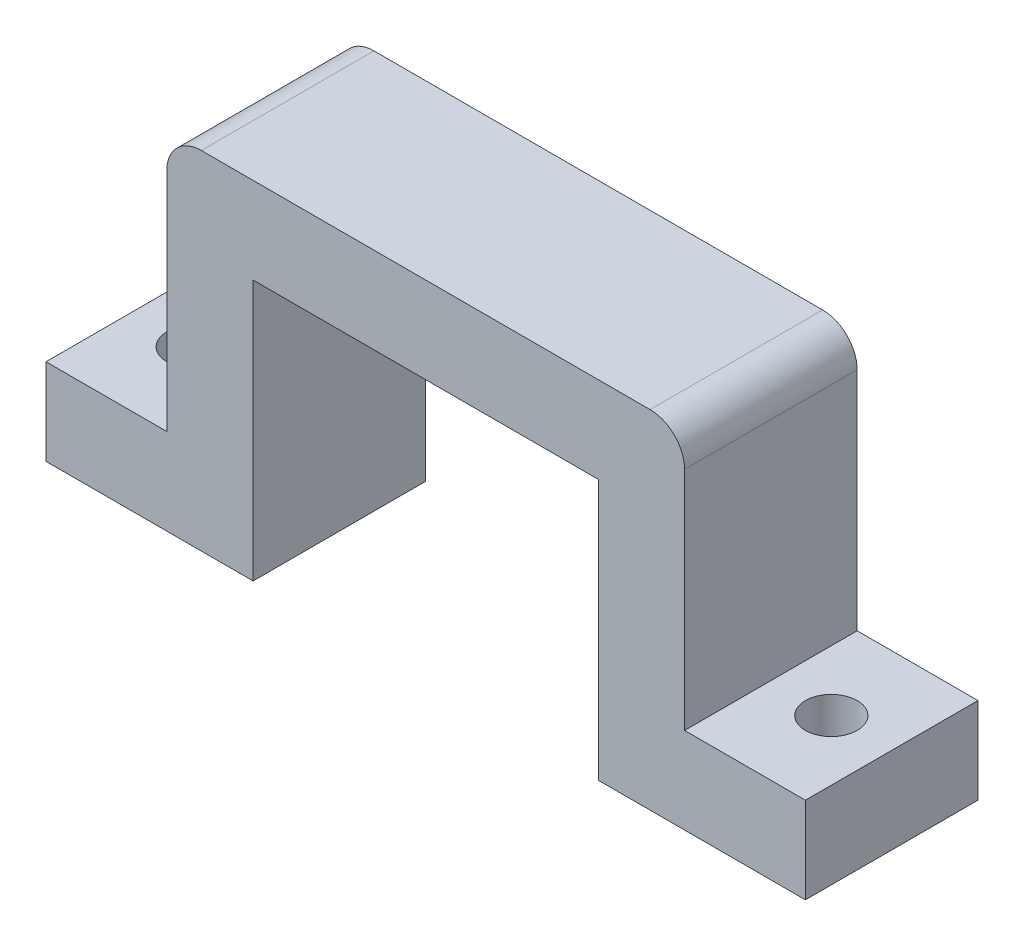
ISO-10303-21;
HEADER;
FILE_DESCRIPTION(('STEP AP214'),'2;1');
FILE_NAME('part.step','',(''),(''),'','','');
FILE_SCHEMA(('AUTOMOTIVE_DESIGN { 1 0 10303 214 1 1 1 1 }'));
ENDSEC;
DATA;
#1=APPLICATION_CONTEXT('core data for automotive mechanical design processes');
#2=APPLICATION_PROTOCOL_DEFINITION('international standard','automotive_design',2000,#1);
#3=PRODUCT_CONTEXT('',#1,'mechanical');
#4=PRODUCT('Part','Part','',(#3));
#5=PRODUCT_RELATED_PRODUCT_CATEGORY('part','',(#4));
#6=PRODUCT_DEFINITION_FORMATION('','',#4);
#7=PRODUCT_DEFINITION_CONTEXT('part definition',#1,'design');
#8=PRODUCT_DEFINITION('design','',#6,#7);
#9=PRODUCT_DEFINITION_SHAPE('','',#8);
#10=(LENGTH_UNIT() NAMED_UNIT(*) SI_UNIT(.MILLI.,.METRE.));
#11=(NAMED_UNIT(*) PLANE_ANGLE_UNIT() SI_UNIT($,.RADIAN.));
#12=(NAMED_UNIT(*) SI_UNIT($,.STERADIAN.) SOLID_ANGLE_UNIT());
#13=UNCERTAINTY_MEASURE_WITH_UNIT(LENGTH_MEASURE(1.E-05),#10,'distance_accuracy_value','');
#14=(GEOMETRIC_REPRESENTATION_CONTEXT(3) GLOBAL_UNCERTAINTY_ASSIGNED_CONTEXT((#13)) GLOBAL_UNIT_ASSIGNED_CONTEXT((#10,
#11,#12)) REPRESENTATION_CONTEXT('',''));
#15=CARTESIAN_POINT('',(0.,0.,0.));
#16=DIRECTION('',(0.,0.,1.));
#17=DIRECTION('',(1.,0.,0.));
#18=AXIS2_PLACEMENT_3D('',#15,#16,#17);
#19=CARTESIAN_POINT('',(0.,0.,10.));
#20=DIRECTION('',(0.,1.,0.));
#21=DIRECTION('',(-1.,0.,0.));
#22=AXIS2_PLACEMENT_3D('',#19,#20,#21);
#23=PLANE('',#22);
#24=CARTESIAN_POINT('',(-8.5,0.,5.));
#25=DIRECTION('',(0.,1.,0.));
#26=DIRECTION('',(-1.,0.,0.));
#27=AXIS2_PLACEMENT_3D('',#24,#25,#26);
#28=CIRCLE('',#27,1.5);
#29=CARTESIAN_POINT('',(-10.,0.,5.));
#30=VERTEX_POINT('',#29);
#31=EDGE_CURVE('E294',#30,#30,#28,.T.);
#32=ORIENTED_EDGE('',*,*,#31,.T.);
#33=EDGE_LOOP('',(#32));
#34=FACE_BOUND('',#33,.T.);
#35=DIRECTION('',(1.,0.,0.));
#36=VECTOR('',#35,1.);
#37=CARTESIAN_POINT('',(0.,0.,0.));
#38=LINE('',#37,#36);
#39=CARTESIAN_POINT('',(-12.,0.,0.));
#40=VERTEX_POINT('',#39);
#41=CARTESIAN_POINT('',(0.,0.,0.));
#42=VERTEX_POINT('',#41);
#43=EDGE_CURVE('E171',#40,#42,#38,.T.);
#44=ORIENTED_EDGE('',*,*,#43,.T.);
#45=DIRECTION('',(0.,0.,-1.));
#46=VECTOR('',#45,1.);
#47=CARTESIAN_POINT('',(0.,0.,10.));
#48=LINE('',#47,#46);
#49=CARTESIAN_POINT('',(0.,0.,10.));
#50=VERTEX_POINT('',#49);
#51=EDGE_CURVE('E11',#50,#42,#48,.T.);
#52=ORIENTED_EDGE('',*,*,#51,.F.);
#53=DIRECTION('',(1.,0.,0.));
#54=VECTOR('',#53,1.);
#55=CARTESIAN_POINT('',(0.,0.,10.));
#56=LINE('',#55,#54);
#57=CARTESIAN_POINT('',(-12.,0.,10.));
#58=VERTEX_POINT('',#57);
#59=EDGE_CURVE('E198',#58,#50,#56,.T.);
#60=ORIENTED_EDGE('',*,*,#59,.F.);
#61=DIRECTION('',(0.,0.,-1.));
#62=VECTOR('',#61,1.);
#63=CARTESIAN_POINT('',(-12.,0.,10.));
#64=LINE('',#63,#62);
#65=EDGE_CURVE('E167',#58,#40,#64,.T.);
#66=ORIENTED_EDGE('',*,*,#65,.T.);
#67=EDGE_LOOP('',(#44,#52,#60,#66));
#68=FACE_BOUND('',#67,.T.);
#69=ADVANCED_FACE('F39',(#34,#68),#23,.F.);
#70=CARTESIAN_POINT('',(0.,0.,10.));
#71=DIRECTION('',(-1.,0.,0.));
#72=DIRECTION('',(0.,0.,1.));
#73=AXIS2_PLACEMENT_3D('',#70,#71,#72);
#74=PLANE('',#73);
#75=DIRECTION('',(0.,1.,0.));
#76=VECTOR('',#75,1.);
#77=CARTESIAN_POINT('',(0.,0.,0.));
#78=LINE('',#77,#76);
#79=CARTESIAN_POINT('',(0.,15.1,0.));
#80=VERTEX_POINT('',#79);
#81=EDGE_CURVE('E174',#42,#80,#78,.T.);
#82=ORIENTED_EDGE('',*,*,#81,.T.);
#83=DIRECTION('',(0.,0.,-1.));
#84=VECTOR('',#83,1.);
#85=CARTESIAN_POINT('',(0.,15.1,10.));
#86=LINE('',#85,#84);
#87=CARTESIAN_POINT('',(0.,15.1,10.));
#88=VERTEX_POINT('',#87);
#89=EDGE_CURVE('E47',#88,#80,#86,.T.);
#90=ORIENTED_EDGE('',*,*,#89,.F.);
#91=DIRECTION('',(0.,1.,0.));
#92=VECTOR('',#91,1.);
#93=CARTESIAN_POINT('',(0.,0.,10.));
#94=LINE('',#93,#92);
#95=EDGE_CURVE('E116',#50,#88,#94,.T.);
#96=ORIENTED_EDGE('',*,*,#95,.F.);
#97=ORIENTED_EDGE('',*,*,#51,.T.);
#98=EDGE_LOOP('',(#82,#90,#96,#97));
#99=FACE_BOUND('',#98,.T.);
#100=ADVANCED_FACE('F287',(#99),#74,.F.);
#101=CARTESIAN_POINT('',(0.,15.1,10.));
#102=DIRECTION('',(0.,1.,0.));
#103=DIRECTION('',(0.,0.,1.));
#104=AXIS2_PLACEMENT_3D('',#101,#102,#103);
#105=PLANE('',#104);
#106=DIRECTION('',(1.,0.,0.));
#107=VECTOR('',#106,1.);
#108=CARTESIAN_POINT('',(0.,15.1,0.));
#109=LINE('',#108,#107);
#110=CARTESIAN_POINT('',(20.,15.1,0.));
#111=VERTEX_POINT('',#110);
#112=EDGE_CURVE('E177',#80,#111,#109,.T.);
#113=ORIENTED_EDGE('',*,*,#112,.T.);
#114=DIRECTION('',(0.,0.,-1.));
#115=VECTOR('',#114,1.);
#116=CARTESIAN_POINT('',(20.,15.1,10.));
#117=LINE('',#116,#115);
#118=CARTESIAN_POINT('',(20.,15.1,10.));
#119=VERTEX_POINT('',#118);
#120=EDGE_CURVE('E223',#119,#111,#117,.T.);
#121=ORIENTED_EDGE('',*,*,#120,.F.);
#122=DIRECTION('',(1.,0.,0.));
#123=VECTOR('',#122,1.);
#124=CARTESIAN_POINT('',(0.,15.1,10.));
#125=LINE('',#124,#123);
#126=EDGE_CURVE('E231',#88,#119,#125,.T.);
#127=ORIENTED_EDGE('',*,*,#126,.F.);
#128=ORIENTED_EDGE('',*,*,#89,.T.);
#129=EDGE_LOOP('',(#113,#121,#127,#128));
#130=FACE_BOUND('',#129,.T.);
#131=ADVANCED_FACE('F229',(#130),#105,.F.);
#132=CARTESIAN_POINT('',(20.,15.1,10.));
#133=DIRECTION('',(1.,0.,0.));
#134=DIRECTION('',(0.,1.,0.));
#135=AXIS2_PLACEMENT_3D('',#132,#133,#134);
#136=PLANE('',#135);
#137=DIRECTION('',(0.,-1.,0.));
#138=VECTOR('',#137,1.);
#139=CARTESIAN_POINT('',(20.,15.1,0.));
#140=LINE('',#139,#138);
#141=CARTESIAN_POINT('',(20.,0.,0.));
#142=VERTEX_POINT('',#141);
#143=EDGE_CURVE('E179',#111,#142,#140,.T.);
#144=ORIENTED_EDGE('',*,*,#143,.T.);
#145=DIRECTION('',(0.,0.,-1.));
#146=VECTOR('',#145,1.);
#147=CARTESIAN_POINT('',(20.,0.,10.));
#148=LINE('',#147,#146);
#149=CARTESIAN_POINT('',(20.,0.,10.));
#150=VERTEX_POINT('',#149);
#151=EDGE_CURVE('E220',#150,#142,#148,.T.);
#152=ORIENTED_EDGE('',*,*,#151,.F.);
#153=DIRECTION('',(0.,-1.,0.));
#154=VECTOR('',#153,1.);
#155=CARTESIAN_POINT('',(20.,15.1,10.));
#156=LINE('',#155,#154);
#157=EDGE_CURVE('E249',#119,#150,#156,.T.);
#158=ORIENTED_EDGE('',*,*,#157,.F.);
#159=ORIENTED_EDGE('',*,*,#120,.T.);
#160=EDGE_LOOP('',(#144,#152,#158,#159));
#161=FACE_BOUND('',#160,.T.);
#162=ADVANCED_FACE('F240',(#161),#136,.F.);
#163=CARTESIAN_POINT('',(20.,0.,10.));
#164=DIRECTION('',(0.,1.,0.));
#165=DIRECTION('',(-1.,0.,0.));
#166=AXIS2_PLACEMENT_3D('',#163,#164,#165);
#167=PLANE('',#166);
#168=CARTESIAN_POINT('',(28.5,0.,5.));
#169=DIRECTION('',(0.,1.,0.));
#170=DIRECTION('',(-1.,0.,0.));
#171=AXIS2_PLACEMENT_3D('',#168,#169,#170);
#172=CIRCLE('',#171,1.5);
#173=CARTESIAN_POINT('',(27.,0.,5.));
#174=VERTEX_POINT('',#173);
#175=EDGE_CURVE('E175',#174,#174,#172,.T.);
#176=ORIENTED_EDGE('',*,*,#175,.T.);
#177=EDGE_LOOP('',(#176));
#178=FACE_BOUND('',#177,.T.);
#179=DIRECTION('',(1.,0.,0.));
#180=VECTOR('',#179,1.);
#181=CARTESIAN_POINT('',(20.,0.,0.));
#182=LINE('',#181,#180);
#183=CARTESIAN_POINT('',(32.,0.,0.));
#184=VERTEX_POINT('',#183);
#185=EDGE_CURVE('E181',#142,#184,#182,.T.);
#186=ORIENTED_EDGE('',*,*,#185,.T.);
#187=DIRECTION('',(0.,0.,-1.));
#188=VECTOR('',#187,1.);
#189=CARTESIAN_POINT('',(32.,0.,10.));
#190=LINE('',#189,#188);
#191=CARTESIAN_POINT('',(32.,0.,10.));
#192=VERTEX_POINT('',#191);
#193=EDGE_CURVE('E217',#192,#184,#190,.T.);
#194=ORIENTED_EDGE('',*,*,#193,.F.);
#195=DIRECTION('',(1.,0.,0.));
#196=VECTOR('',#195,1.);
#197=CARTESIAN_POINT('',(20.,0.,10.));
#198=LINE('',#197,#196);
#199=EDGE_CURVE('E246',#150,#192,#198,.T.);
#200=ORIENTED_EDGE('',*,*,#199,.F.);
#201=ORIENTED_EDGE('',*,*,#151,.T.);
#202=EDGE_LOOP('',(#186,#194,#200,#201));
#203=FACE_BOUND('',#202,.T.);
#204=ADVANCED_FACE('F244',(#178,#203),#167,.F.);
#205=CARTESIAN_POINT('',(32.,5.00000000000001,10.));
#206=DIRECTION('',(-1.,0.,0.));
#207=DIRECTION('',(0.,0.,1.));
#208=AXIS2_PLACEMENT_3D('',#205,#206,#207);
#209=PLANE('',#208);
#210=DIRECTION('',(0.,1.,0.));
#211=VECTOR('',#210,1.);
#212=CARTESIAN_POINT('',(32.,5.00000000000001,0.));
#213=LINE('',#212,#211);
#214=CARTESIAN_POINT('',(32.,5.00000000000001,0.));
#215=VERTEX_POINT('',#214);
#216=EDGE_CURVE('E183',#184,#215,#213,.T.);
#217=ORIENTED_EDGE('',*,*,#216,.T.);
#218=DIRECTION('',(0.,0.,-1.));
#219=VECTOR('',#218,1.);
#220=CARTESIAN_POINT('',(32.,5.00000000000001,10.));
#221=LINE('',#220,#219);
#222=CARTESIAN_POINT('',(32.,5.00000000000001,10.));
#223=VERTEX_POINT('',#222);
#224=EDGE_CURVE('E214',#223,#215,#221,.T.);
#225=ORIENTED_EDGE('',*,*,#224,.F.);
#226=DIRECTION('',(0.,1.,0.));
#227=VECTOR('',#226,1.);
#228=CARTESIAN_POINT('',(32.,5.00000000000001,10.));
#229=LINE('',#228,#227);
#230=EDGE_CURVE('E248',#192,#223,#229,.T.);
#231=ORIENTED_EDGE('',*,*,#230,.F.);
#232=ORIENTED_EDGE('',*,*,#193,.T.);
#233=EDGE_LOOP('',(#217,#225,#231,#232));
#234=FACE_BOUND('',#233,.T.);
#235=ADVANCED_FACE('F316',(#234),#209,.F.);
#236=CARTESIAN_POINT('',(25.,5.,10.));
#237=DIRECTION('',(0.,-1.,0.));
#238=DIRECTION('',(1.,0.,0.));
#239=AXIS2_PLACEMENT_3D('',#236,#237,#238);
#240=PLANE('',#239);
#241=CARTESIAN_POINT('',(28.5,5.,5.));
#242=DIRECTION('',(0.,1.,0.));
#243=DIRECTION('',(0.,0.,-1.));
#244=AXIS2_PLACEMENT_3D('',#241,#242,#243);
#245=CIRCLE('',#244,1.5);
#246=CARTESIAN_POINT('',(28.5,5.,3.5));
#247=VERTEX_POINT('',#246);
#248=EDGE_CURVE('E301',#247,#247,#245,.T.);
#249=ORIENTED_EDGE('',*,*,#248,.F.);
#250=EDGE_LOOP('',(#249));
#251=FACE_BOUND('',#250,.T.);
#252=DIRECTION('',(-1.,0.,0.));
#253=VECTOR('',#252,1.);
#254=CARTESIAN_POINT('',(25.,5.,0.));
#255=LINE('',#254,#253);
#256=CARTESIAN_POINT('',(25.,5.,0.));
#257=VERTEX_POINT('',#256);
#258=EDGE_CURVE('E185',#215,#257,#255,.T.);
#259=ORIENTED_EDGE('',*,*,#258,.T.);
#260=DIRECTION('',(0.,0.,-1.));
#261=VECTOR('',#260,1.);
#262=CARTESIAN_POINT('',(25.,5.,10.));
#263=LINE('',#262,#261);
#264=CARTESIAN_POINT('',(25.,5.,10.));
#265=VERTEX_POINT('',#264);
#266=EDGE_CURVE('E211',#265,#257,#263,.T.);
#267=ORIENTED_EDGE('',*,*,#266,.F.);
#268=DIRECTION('',(-1.,0.,0.));
#269=VECTOR('',#268,1.);
#270=CARTESIAN_POINT('',(25.,5.,10.));
#271=LINE('',#270,#269);
#272=EDGE_CURVE('E251',#223,#265,#271,.T.);
#273=ORIENTED_EDGE('',*,*,#272,.F.);
#274=ORIENTED_EDGE('',*,*,#224,.T.);
#275=EDGE_LOOP('',(#259,#267,#273,#274));
#276=FACE_BOUND('',#275,.T.);
#277=ADVANCED_FACE('F312',(#251,#276),#240,.F.);
#278=CARTESIAN_POINT('',(25.,18.1,10.));
#279=DIRECTION('',(-1.,0.,0.));
#280=DIRECTION('',(0.,0.,1.));
#281=AXIS2_PLACEMENT_3D('',#278,#279,#280);
#282=PLANE('',#281);
#283=DIRECTION('',(0.,1.,0.));
#284=VECTOR('',#283,1.);
#285=CARTESIAN_POINT('',(25.,18.1,0.));
#286=LINE('',#285,#284);
#287=CARTESIAN_POINT('',(25.,18.1,0.));
#288=VERTEX_POINT('',#287);
#289=EDGE_CURVE('E187',#257,#288,#286,.T.);
#290=ORIENTED_EDGE('',*,*,#289,.T.);
#291=DIRECTION('',(0.,0.,-1.));
#292=VECTOR('',#291,1.);
#293=CARTESIAN_POINT('',(25.,18.1,10.));
#294=LINE('',#293,#292);
#295=CARTESIAN_POINT('',(25.,18.1,10.));
#296=VERTEX_POINT('',#295);
#297=EDGE_CURVE('E208',#296,#288,#294,.T.);
#298=ORIENTED_EDGE('',*,*,#297,.F.);
#299=DIRECTION('',(0.,1.,0.));
#300=VECTOR('',#299,1.);
#301=CARTESIAN_POINT('',(25.,18.1,10.));
#302=LINE('',#301,#300);
#303=EDGE_CURVE('E257',#265,#296,#302,.T.);
#304=ORIENTED_EDGE('',*,*,#303,.F.);
#305=ORIENTED_EDGE('',*,*,#266,.T.);
#306=EDGE_LOOP('',(#290,#298,#304,#305));
#307=FACE_BOUND('',#306,.T.);
#308=ADVANCED_FACE('F315',(#307),#282,.F.);
#309=CARTESIAN_POINT('',(23.,18.1,10.));
#310=DIRECTION('',(0.,0.,-1.));
#311=DIRECTION('',(-1.,0.,0.));
#312=AXIS2_PLACEMENT_3D('',#309,#310,#311);
#313=CYLINDRICAL_SURFACE('',#312,2.);
#314=CARTESIAN_POINT('',(23.,18.1,0.));
#315=DIRECTION('',(0.,0.,1.));
#316=DIRECTION('',(-1.,0.,0.));
#317=AXIS2_PLACEMENT_3D('',#314,#315,#316);
#318=CIRCLE('',#317,2.);
#319=CARTESIAN_POINT('',(23.,20.1,0.));
#320=VERTEX_POINT('',#319);
#321=EDGE_CURVE('E189',#288,#320,#318,.T.);
#322=ORIENTED_EDGE('',*,*,#321,.T.);
#323=DIRECTION('',(0.,0.,-1.));
#324=VECTOR('',#323,1.);
#325=CARTESIAN_POINT('',(23.,20.1,10.));
#326=LINE('',#325,#324);
#327=CARTESIAN_POINT('',(23.,20.1,10.));
#328=VERTEX_POINT('',#327);
#329=EDGE_CURVE('E205',#328,#320,#326,.T.);
#330=ORIENTED_EDGE('',*,*,#329,.F.);
#331=CARTESIAN_POINT('',(23.,18.1,10.));
#332=DIRECTION('',(0.,0.,1.));
#333=DIRECTION('',(-1.,0.,0.));
#334=AXIS2_PLACEMENT_3D('',#331,#332,#333);
#335=CIRCLE('',#334,2.);
#336=EDGE_CURVE('E259',#296,#328,#335,.T.);
#337=ORIENTED_EDGE('',*,*,#336,.F.);
#338=ORIENTED_EDGE('',*,*,#297,.T.);
#339=EDGE_LOOP('',(#322,#330,#337,#338));
#340=FACE_BOUND('',#339,.T.);
#341=ADVANCED_FACE('F328',(#340),#313,.T.);
#342=CARTESIAN_POINT('',(-2.99999999999999,20.1,10.));
#343=DIRECTION('',(0.,-1.,0.));
#344=DIRECTION('',(0.,0.,-1.));
#345=AXIS2_PLACEMENT_3D('',#342,#343,#344);
#346=PLANE('',#345);
#347=DIRECTION('',(-1.,0.,0.));
#348=VECTOR('',#347,1.);
#349=CARTESIAN_POINT('',(-2.99999999999999,20.1,0.));
#350=LINE('',#349,#348);
#351=CARTESIAN_POINT('',(-2.99999999999999,20.1,0.));
#352=VERTEX_POINT('',#351);
#353=EDGE_CURVE('E191',#320,#352,#350,.T.);
#354=ORIENTED_EDGE('',*,*,#353,.T.);
#355=DIRECTION('',(0.,0.,-1.));
#356=VECTOR('',#355,1.);
#357=CARTESIAN_POINT('',(-2.99999999999999,20.1,10.));
#358=LINE('',#357,#356);
#359=CARTESIAN_POINT('',(-2.99999999999999,20.1,10.));
#360=VERTEX_POINT('',#359);
#361=EDGE_CURVE('E202',#360,#352,#358,.T.);
#362=ORIENTED_EDGE('',*,*,#361,.F.);
#363=DIRECTION('',(-1.,0.,0.));
#364=VECTOR('',#363,1.);
#365=CARTESIAN_POINT('',(-2.99999999999999,20.1,10.));
#366=LINE('',#365,#364);
#367=EDGE_CURVE('E261',#328,#360,#366,.T.);
#368=ORIENTED_EDGE('',*,*,#367,.F.);
#369=ORIENTED_EDGE('',*,*,#329,.T.);
#370=EDGE_LOOP('',(#354,#362,#368,#369));
#371=FACE_BOUND('',#370,.T.);
#372=ADVANCED_FACE('F267',(#371),#346,.F.);
#373=CARTESIAN_POINT('',(-3.,18.1,10.));
#374=DIRECTION('',(0.,0.,-1.));
#375=DIRECTION('',(-1.,0.,0.));
#376=AXIS2_PLACEMENT_3D('',#373,#374,#375);
#377=CYLINDRICAL_SURFACE('',#376,2.);
#378=CARTESIAN_POINT('',(-3.,18.1,0.));
#379=DIRECTION('',(0.,0.,1.));
#380=DIRECTION('',(-1.,0.,0.));
#381=AXIS2_PLACEMENT_3D('',#378,#379,#380);
#382=CIRCLE('',#381,2.);
#383=CARTESIAN_POINT('',(-5.,18.1,0.));
#384=VERTEX_POINT('',#383);
#385=EDGE_CURVE('E193',#352,#384,#382,.T.);
#386=ORIENTED_EDGE('',*,*,#385,.T.);
#387=DIRECTION('',(0.,0.,-1.));
#388=VECTOR('',#387,1.);
#389=CARTESIAN_POINT('',(-5.,18.1,10.));
#390=LINE('',#389,#388);
#391=CARTESIAN_POINT('',(-5.,18.1,10.));
#392=VERTEX_POINT('',#391);
#393=EDGE_CURVE('E162',#392,#384,#390,.T.);
#394=ORIENTED_EDGE('',*,*,#393,.F.);
#395=CARTESIAN_POINT('',(-3.,18.1,10.));
#396=DIRECTION('',(0.,0.,1.));
#397=DIRECTION('',(-1.,0.,0.));
#398=AXIS2_PLACEMENT_3D('',#395,#396,#397);
#399=CIRCLE('',#398,2.);
#400=EDGE_CURVE('E153',#360,#392,#399,.T.);
#401=ORIENTED_EDGE('',*,*,#400,.F.);
#402=ORIENTED_EDGE('',*,*,#361,.T.);
#403=EDGE_LOOP('',(#386,#394,#401,#402));
#404=FACE_BOUND('',#403,.T.);
#405=ADVANCED_FACE('F271',(#404),#377,.T.);
#406=CARTESIAN_POINT('',(-5.,5.,10.));
#407=DIRECTION('',(1.,0.,0.));
#408=DIRECTION('',(0.,0.,-1.));
#409=AXIS2_PLACEMENT_3D('',#406,#407,#408);
#410=PLANE('',#409);
#411=DIRECTION('',(0.,-1.,0.));
#412=VECTOR('',#411,1.);
#413=CARTESIAN_POINT('',(-5.,5.,0.));
#414=LINE('',#413,#412);
#415=CARTESIAN_POINT('',(-5.,5.,0.));
#416=VERTEX_POINT('',#415);
#417=EDGE_CURVE('E161',#384,#416,#414,.T.);
#418=ORIENTED_EDGE('',*,*,#417,.T.);
#419=DIRECTION('',(0.,0.,-1.));
#420=VECTOR('',#419,1.);
#421=CARTESIAN_POINT('',(-5.,5.,10.));
#422=LINE('',#421,#420);
#423=CARTESIAN_POINT('',(-5.,5.,10.));
#424=VERTEX_POINT('',#423);
#425=EDGE_CURVE('E158',#424,#416,#422,.T.);
#426=ORIENTED_EDGE('',*,*,#425,.F.);
#427=DIRECTION('',(0.,-1.,0.));
#428=VECTOR('',#427,1.);
#429=CARTESIAN_POINT('',(-5.,5.,10.));
#430=LINE('',#429,#428);
#431=EDGE_CURVE('E147',#392,#424,#430,.T.);
#432=ORIENTED_EDGE('',*,*,#431,.F.);
#433=ORIENTED_EDGE('',*,*,#393,.T.);
#434=EDGE_LOOP('',(#418,#426,#432,#433));
#435=FACE_BOUND('',#434,.T.);
#436=ADVANCED_FACE('F159',(#435),#410,.F.);
#437=CARTESIAN_POINT('',(-5.,5.,10.));
#438=DIRECTION('',(0.,-1.,0.));
#439=DIRECTION('',(1.,0.,0.));
#440=AXIS2_PLACEMENT_3D('',#437,#438,#439);
#441=PLANE('',#440);
#442=CARTESIAN_POINT('',(-8.5,5.,5.));
#443=DIRECTION('',(0.,1.,0.));
#444=DIRECTION('',(0.,0.,1.));
#445=AXIS2_PLACEMENT_3D('',#442,#443,#444);
#446=CIRCLE('',#445,1.5);
#447=CARTESIAN_POINT('',(-8.5,5.,6.5));
#448=VERTEX_POINT('',#447);
#449=EDGE_CURVE('E296',#448,#448,#446,.T.);
#450=ORIENTED_EDGE('',*,*,#449,.F.);
#451=EDGE_LOOP('',(#450));
#452=FACE_BOUND('',#451,.T.);
#453=DIRECTION('',(-1.,0.,0.));
#454=VECTOR('',#453,1.);
#455=CARTESIAN_POINT('',(-5.,5.,0.));
#456=LINE('',#455,#454);
#457=CARTESIAN_POINT('',(-12.,5.,0.));
#458=VERTEX_POINT('',#457);
#459=EDGE_CURVE('E102',#416,#458,#456,.T.);
#460=ORIENTED_EDGE('',*,*,#459,.T.);
#461=DIRECTION('',(0.,0.,-1.));
#462=VECTOR('',#461,1.);
#463=CARTESIAN_POINT('',(-12.,5.,10.));
#464=LINE('',#463,#462);
#465=CARTESIAN_POINT('',(-12.,5.,10.));
#466=VERTEX_POINT('',#465);
#467=EDGE_CURVE('E163',#466,#458,#464,.T.);
#468=ORIENTED_EDGE('',*,*,#467,.F.);
#469=DIRECTION('',(-1.,0.,0.));
#470=VECTOR('',#469,1.);
#471=CARTESIAN_POINT('',(-5.,5.,10.));
#472=LINE('',#471,#470);
#473=EDGE_CURVE('E151',#424,#466,#472,.T.);
#474=ORIENTED_EDGE('',*,*,#473,.F.);
#475=ORIENTED_EDGE('',*,*,#425,.T.);
#476=EDGE_LOOP('',(#460,#468,#474,#475));
#477=FACE_BOUND('',#476,.T.);
#478=ADVANCED_FACE('F165',(#452,#477),#441,.F.);
#479=CARTESIAN_POINT('',(-12.,5.,10.));
#480=DIRECTION('',(1.,0.,0.));
#481=DIRECTION('',(0.,0.,-1.));
#482=AXIS2_PLACEMENT_3D('',#479,#480,#481);
#483=PLANE('',#482);
#484=DIRECTION('',(0.,-1.,0.));
#485=VECTOR('',#484,1.);
#486=CARTESIAN_POINT('',(-12.,5.,0.));
#487=LINE('',#486,#485);
#488=EDGE_CURVE('E108',#458,#40,#487,.T.);
#489=ORIENTED_EDGE('',*,*,#488,.T.);
#490=ORIENTED_EDGE('',*,*,#65,.F.);
#491=DIRECTION('',(0.,-1.,0.));
#492=VECTOR('',#491,1.);
#493=CARTESIAN_POINT('',(-12.,5.,10.));
#494=LINE('',#493,#492);
#495=EDGE_CURVE('E55',#466,#58,#494,.T.);
#496=ORIENTED_EDGE('',*,*,#495,.F.);
#497=ORIENTED_EDGE('',*,*,#467,.T.);
#498=EDGE_LOOP('',(#489,#490,#496,#497));
#499=FACE_BOUND('',#498,.T.);
#500=ADVANCED_FACE('F275',(#499),#483,.F.);
#501=CARTESIAN_POINT('',(-3.,18.1,10.));
#502=DIRECTION('',(0.,0.,-1.));
#503=DIRECTION('',(-1.,0.,0.));
#504=AXIS2_PLACEMENT_3D('',#501,#502,#503);
#505=PLANE('',#504);
#506=ORIENTED_EDGE('',*,*,#59,.T.);
#507=ORIENTED_EDGE('',*,*,#95,.T.);
#508=ORIENTED_EDGE('',*,*,#126,.T.);
#509=ORIENTED_EDGE('',*,*,#157,.T.);
#510=ORIENTED_EDGE('',*,*,#199,.T.);
#511=ORIENTED_EDGE('',*,*,#230,.T.);
#512=ORIENTED_EDGE('',*,*,#272,.T.);
#513=ORIENTED_EDGE('',*,*,#303,.T.);
#514=ORIENTED_EDGE('',*,*,#336,.T.);
#515=ORIENTED_EDGE('',*,*,#367,.T.);
#516=ORIENTED_EDGE('',*,*,#400,.T.);
#517=ORIENTED_EDGE('',*,*,#431,.T.);
#518=ORIENTED_EDGE('',*,*,#473,.T.);
#519=ORIENTED_EDGE('',*,*,#495,.T.);
#520=EDGE_LOOP('',(#506,#507,#508,#509,#510,#511,#512,#513,#514,#515,#516,#517,#518,#519));
#521=FACE_BOUND('',#520,.T.);
#522=ADVANCED_FACE('F149',(#521),#505,.F.);
#523=CARTESIAN_POINT('',(-3.,18.1,0.));
#524=DIRECTION('',(0.,0.,-1.));
#525=DIRECTION('',(-1.,0.,0.));
#526=AXIS2_PLACEMENT_3D('',#523,#524,#525);
#527=PLANE('',#526);
#528=ORIENTED_EDGE('',*,*,#43,.F.);
#529=ORIENTED_EDGE('',*,*,#488,.F.);
#530=ORIENTED_EDGE('',*,*,#459,.F.);
#531=ORIENTED_EDGE('',*,*,#417,.F.);
#532=ORIENTED_EDGE('',*,*,#385,.F.);
#533=ORIENTED_EDGE('',*,*,#353,.F.);
#534=ORIENTED_EDGE('',*,*,#321,.F.);
#535=ORIENTED_EDGE('',*,*,#289,.F.);
#536=ORIENTED_EDGE('',*,*,#258,.F.);
#537=ORIENTED_EDGE('',*,*,#216,.F.);
#538=ORIENTED_EDGE('',*,*,#185,.F.);
#539=ORIENTED_EDGE('',*,*,#143,.F.);
#540=ORIENTED_EDGE('',*,*,#112,.F.);
#541=ORIENTED_EDGE('',*,*,#81,.F.);
#542=EDGE_LOOP('',(#528,#529,#530,#531,#532,#533,#534,#535,#536,#537,#538,#539,#540,#541));
#543=FACE_BOUND('',#542,.T.);
#544=ADVANCED_FACE('F235',(#543),#527,.T.);
#545=CARTESIAN_POINT('',(-8.5,-5.,5.));
#546=DIRECTION('',(0.,1.,0.));
#547=DIRECTION('',(0.,0.,1.));
#548=AXIS2_PLACEMENT_3D('',#545,#546,#547);
#549=CYLINDRICAL_SURFACE('',#548,1.5);
#550=ORIENTED_EDGE('',*,*,#449,.T.);
#551=EDGE_LOOP('',(#550));
#552=FACE_BOUND('',#551,.T.);
#553=ORIENTED_EDGE('',*,*,#31,.F.);
#554=EDGE_LOOP('',(#553));
#555=FACE_BOUND('',#554,.T.);
#556=ADVANCED_FACE('F417',(#552,#555),#549,.F.);
#557=CARTESIAN_POINT('',(28.5,-5.,5.));
#558=DIRECTION('',(0.,1.,0.));
#559=DIRECTION('',(0.,0.,1.));
#560=AXIS2_PLACEMENT_3D('',#557,#558,#559);
#561=CYLINDRICAL_SURFACE('',#560,1.5);
#562=ORIENTED_EDGE('',*,*,#248,.T.);
#563=EDGE_LOOP('',(#562));
#564=FACE_BOUND('',#563,.T.);
#565=ORIENTED_EDGE('',*,*,#175,.F.);
#566=EDGE_LOOP('',(#565));
#567=FACE_BOUND('',#566,.T.);
#568=ADVANCED_FACE('F309',(#564,#567),#561,.F.);
#569=CLOSED_SHELL('',(#69,#100,#131,#162,#204,#235,#277,#308,#341,#372,#405,#436,#478,#500,#522,
#544,#556,#568));
#570=MANIFOLD_SOLID_BREP('B2',#569);
#571=ADVANCED_BREP_SHAPE_REPRESENTATION('',(#18,#570),#14);
#572=SHAPE_DEFINITION_REPRESENTATION(#9,#571);
ENDSEC;
END-ISO-10303-21;
